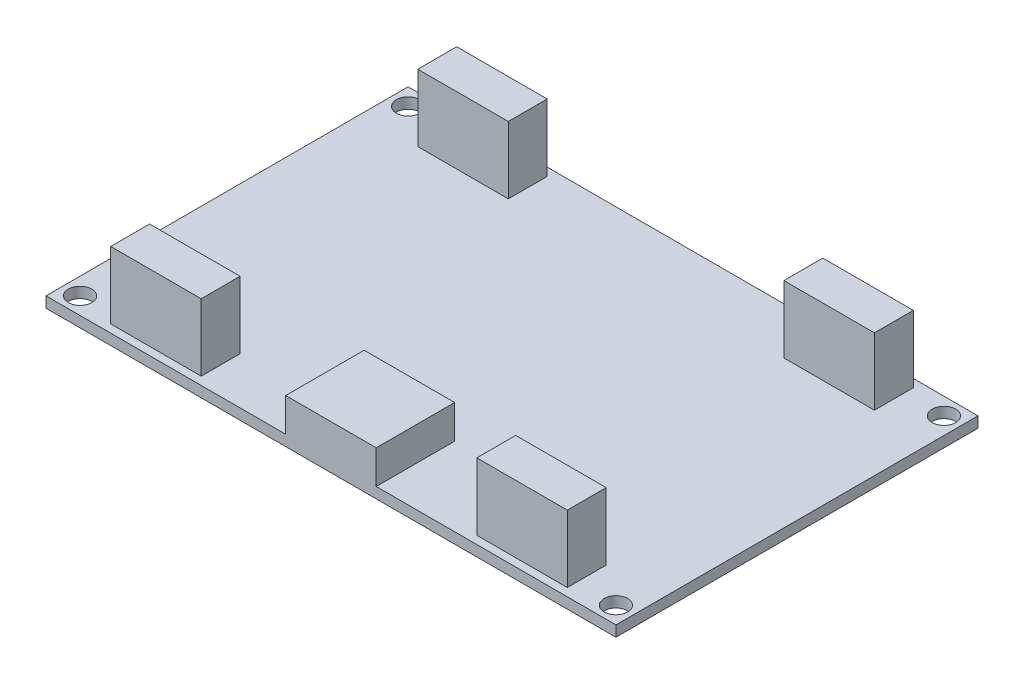
ISO-10303-21;
HEADER;
FILE_DESCRIPTION(('STEP AP214'),'2;1');
FILE_NAME('part.step','',(''),(''),'','','');
FILE_SCHEMA(('AUTOMOTIVE_DESIGN { 1 0 10303 214 1 1 1 1 }'));
ENDSEC;
DATA;
#1=APPLICATION_CONTEXT('core data for automotive mechanical design processes');
#2=APPLICATION_PROTOCOL_DEFINITION('international standard','automotive_design',2000,#1);
#3=PRODUCT_CONTEXT('',#1,'mechanical');
#4=PRODUCT('Part','Part','',(#3));
#5=PRODUCT_RELATED_PRODUCT_CATEGORY('part','',(#4));
#6=PRODUCT_DEFINITION_FORMATION('','',#4);
#7=PRODUCT_DEFINITION_CONTEXT('part definition',#1,'design');
#8=PRODUCT_DEFINITION('design','',#6,#7);
#9=PRODUCT_DEFINITION_SHAPE('','',#8);
#10=(LENGTH_UNIT() NAMED_UNIT(*) SI_UNIT(.MILLI.,.METRE.));
#11=(NAMED_UNIT(*) PLANE_ANGLE_UNIT() SI_UNIT($,.RADIAN.));
#12=(NAMED_UNIT(*) SI_UNIT($,.STERADIAN.) SOLID_ANGLE_UNIT());
#13=UNCERTAINTY_MEASURE_WITH_UNIT(LENGTH_MEASURE(1.E-05),#10,'distance_accuracy_value','');
#14=(GEOMETRIC_REPRESENTATION_CONTEXT(3) GLOBAL_UNCERTAINTY_ASSIGNED_CONTEXT((#13)) GLOBAL_UNIT_ASSIGNED_CONTEXT((#10,
#11,#12)) REPRESENTATION_CONTEXT('',''));
#15=CARTESIAN_POINT('',(0.,0.,0.));
#16=DIRECTION('',(0.,0.,1.));
#17=DIRECTION('',(1.,0.,0.));
#18=AXIS2_PLACEMENT_3D('',#15,#16,#17);
#19=CARTESIAN_POINT('',(0.,1.6,-54.));
#20=DIRECTION('',(0.,-1.,0.));
#21=DIRECTION('',(0.,0.,-1.));
#22=AXIS2_PLACEMENT_3D('',#19,#20,#21);
#23=PLANE('',#22);
#24=DIRECTION('',(0.,0.,-1.));
#25=VECTOR('',#24,1.);
#26=CARTESIAN_POINT('',(76.55,1.6,-7.));
#27=LINE('',#26,#25);
#28=CARTESIAN_POINT('',(76.55,1.6,-1.2));
#29=VERTEX_POINT('',#28);
#30=CARTESIAN_POINT('',(76.55,1.6,-7.));
#31=VERTEX_POINT('',#30);
#32=EDGE_CURVE('E382',#29,#31,#27,.T.);
#33=ORIENTED_EDGE('',*,*,#32,.F.);
#34=DIRECTION('',(1.,0.,0.));
#35=VECTOR('',#34,1.);
#36=CARTESIAN_POINT('',(63.05,1.6,-1.2));
#37=LINE('',#36,#35);
#38=CARTESIAN_POINT('',(63.05,1.6,-1.2));
#39=VERTEX_POINT('',#38);
#40=EDGE_CURVE('E384',#39,#29,#37,.T.);
#41=ORIENTED_EDGE('',*,*,#40,.F.);
#42=DIRECTION('',(0.,0.,1.));
#43=VECTOR('',#42,1.);
#44=CARTESIAN_POINT('',(63.05,1.6,-7.));
#45=LINE('',#44,#43);
#46=CARTESIAN_POINT('',(63.05,1.6,-7.));
#47=VERTEX_POINT('',#46);
#48=EDGE_CURVE('E387',#47,#39,#45,.T.);
#49=ORIENTED_EDGE('',*,*,#48,.F.);
#50=DIRECTION('',(-1.,0.,0.));
#51=VECTOR('',#50,1.);
#52=CARTESIAN_POINT('',(63.05,1.6,-7.));
#53=LINE('',#52,#51);
#54=EDGE_CURVE('E390',#31,#47,#53,.T.);
#55=ORIENTED_EDGE('',*,*,#54,.F.);
#56=EDGE_LOOP('',(#33,#41,#49,#55));
#57=FACE_BOUND('',#56,.T.);
#58=DIRECTION('',(0.,0.,-1.));
#59=VECTOR('',#58,1.);
#60=CARTESIAN_POINT('',(21.95,1.6,-7.));
#61=LINE('',#60,#59);
#62=CARTESIAN_POINT('',(21.95,1.6,-1.2));
#63=VERTEX_POINT('',#62);
#64=CARTESIAN_POINT('',(21.95,1.6,-7.));
#65=VERTEX_POINT('',#64);
#66=EDGE_CURVE('E347',#63,#65,#61,.T.);
#67=ORIENTED_EDGE('',*,*,#66,.F.);
#68=DIRECTION('',(1.,0.,0.));
#69=VECTOR('',#68,1.);
#70=CARTESIAN_POINT('',(8.45000000000001,1.6,-1.2));
#71=LINE('',#70,#69);
#72=CARTESIAN_POINT('',(8.45000000000001,1.6,-1.2));
#73=VERTEX_POINT('',#72);
#74=EDGE_CURVE('E349',#73,#63,#71,.T.);
#75=ORIENTED_EDGE('',*,*,#74,.F.);
#76=DIRECTION('',(0.,0.,1.));
#77=VECTOR('',#76,1.);
#78=CARTESIAN_POINT('',(8.45000000000001,1.6,-7.));
#79=LINE('',#78,#77);
#80=CARTESIAN_POINT('',(8.45000000000001,1.6,-7.));
#81=VERTEX_POINT('',#80);
#82=EDGE_CURVE('E352',#81,#73,#79,.T.);
#83=ORIENTED_EDGE('',*,*,#82,.F.);
#84=DIRECTION('',(-1.,0.,0.));
#85=VECTOR('',#84,1.);
#86=CARTESIAN_POINT('',(8.45000000000001,1.6,-7.));
#87=LINE('',#86,#85);
#88=EDGE_CURVE('E355',#65,#81,#87,.T.);
#89=ORIENTED_EDGE('',*,*,#88,.F.);
#90=EDGE_LOOP('',(#67,#75,#83,#89));
#91=FACE_BOUND('',#90,.T.);
#92=DIRECTION('',(0.,0.,-1.));
#93=VECTOR('',#92,1.);
#94=CARTESIAN_POINT('',(76.55,1.6,-52.8));
#95=LINE('',#94,#93);
#96=CARTESIAN_POINT('',(76.55,1.6,-47.));
#97=VERTEX_POINT('',#96);
#98=CARTESIAN_POINT('',(76.55,1.6,-52.8));
#99=VERTEX_POINT('',#98);
#100=EDGE_CURVE('E256',#97,#99,#95,.T.);
#101=ORIENTED_EDGE('',*,*,#100,.F.);
#102=DIRECTION('',(1.,0.,0.));
#103=VECTOR('',#102,1.);
#104=CARTESIAN_POINT('',(63.05,1.6,-47.));
#105=LINE('',#104,#103);
#106=CARTESIAN_POINT('',(63.05,1.6,-47.));
#107=VERTEX_POINT('',#106);
#108=EDGE_CURVE('E221',#107,#97,#105,.T.);
#109=ORIENTED_EDGE('',*,*,#108,.F.);
#110=DIRECTION('',(0.,0.,1.));
#111=VECTOR('',#110,1.);
#112=CARTESIAN_POINT('',(63.05,1.6,-52.8));
#113=LINE('',#112,#111);
#114=CARTESIAN_POINT('',(63.05,1.6,-52.8));
#115=VERTEX_POINT('',#114);
#116=EDGE_CURVE('E244',#115,#107,#113,.T.);
#117=ORIENTED_EDGE('',*,*,#116,.F.);
#118=DIRECTION('',(-1.,0.,0.));
#119=VECTOR('',#118,1.);
#120=CARTESIAN_POINT('',(63.05,1.6,-52.8));
#121=LINE('',#120,#119);
#122=EDGE_CURVE('E250',#99,#115,#121,.T.);
#123=ORIENTED_EDGE('',*,*,#122,.F.);
#124=EDGE_LOOP('',(#101,#109,#117,#123));
#125=FACE_BOUND('',#124,.T.);
#126=CARTESIAN_POINT('',(82.46,1.6,-2.54));
#127=DIRECTION('',(0.,1.,0.));
#128=DIRECTION('',(0.,0.,1.));
#129=AXIS2_PLACEMENT_3D('',#126,#127,#128);
#130=CIRCLE('',#129,1.75);
#131=CARTESIAN_POINT('',(82.46,1.6,-0.789999999999999));
#132=VERTEX_POINT('',#131);
#133=EDGE_CURVE('E310',#132,#132,#130,.T.);
#134=ORIENTED_EDGE('',*,*,#133,.F.);
#135=EDGE_LOOP('',(#134));
#136=FACE_BOUND('',#135,.T.);
#137=CARTESIAN_POINT('',(82.46,1.6,-51.46));
#138=DIRECTION('',(0.,1.,0.));
#139=DIRECTION('',(0.,0.,1.));
#140=AXIS2_PLACEMENT_3D('',#137,#138,#139);
#141=CIRCLE('',#140,1.75);
#142=CARTESIAN_POINT('',(82.46,1.6,-49.71));
#143=VERTEX_POINT('',#142);
#144=EDGE_CURVE('E304',#143,#143,#141,.T.);
#145=ORIENTED_EDGE('',*,*,#144,.F.);
#146=EDGE_LOOP('',(#145));
#147=FACE_BOUND('',#146,.T.);
#148=CARTESIAN_POINT('',(2.54,1.6,-51.46));
#149=DIRECTION('',(0.,1.,0.));
#150=DIRECTION('',(0.,0.,1.));
#151=AXIS2_PLACEMENT_3D('',#148,#149,#150);
#152=CIRCLE('',#151,1.75);
#153=CARTESIAN_POINT('',(2.54,1.6,-49.71));
#154=VERTEX_POINT('',#153);
#155=EDGE_CURVE('E298',#154,#154,#152,.T.);
#156=ORIENTED_EDGE('',*,*,#155,.F.);
#157=EDGE_LOOP('',(#156));
#158=FACE_BOUND('',#157,.T.);
#159=CARTESIAN_POINT('',(2.54,1.6,-2.54));
#160=DIRECTION('',(0.,1.,0.));
#161=DIRECTION('',(0.,0.,1.));
#162=AXIS2_PLACEMENT_3D('',#159,#160,#161);
#163=CIRCLE('',#162,1.75);
#164=CARTESIAN_POINT('',(2.54,1.6,-0.79));
#165=VERTEX_POINT('',#164);
#166=EDGE_CURVE('E292',#165,#165,#163,.T.);
#167=ORIENTED_EDGE('',*,*,#166,.F.);
#168=EDGE_LOOP('',(#167));
#169=FACE_BOUND('',#168,.T.);
#170=DIRECTION('',(0.,0.,-1.));
#171=VECTOR('',#170,1.);
#172=CARTESIAN_POINT('',(21.95,1.6,-52.8));
#173=LINE('',#172,#171);
#174=CARTESIAN_POINT('',(21.95,1.6,-47.));
#175=VERTEX_POINT('',#174);
#176=CARTESIAN_POINT('',(21.95,1.6,-52.8));
#177=VERTEX_POINT('',#176);
#178=EDGE_CURVE('E259',#175,#177,#173,.T.);
#179=ORIENTED_EDGE('',*,*,#178,.F.);
#180=DIRECTION('',(1.,0.,0.));
#181=VECTOR('',#180,1.);
#182=CARTESIAN_POINT('',(8.45000000000001,1.6,-47.));
#183=LINE('',#182,#181);
#184=CARTESIAN_POINT('',(8.45000000000001,1.6,-47.));
#185=VERTEX_POINT('',#184);
#186=EDGE_CURVE('E264',#185,#175,#183,.T.);
#187=ORIENTED_EDGE('',*,*,#186,.F.);
#188=DIRECTION('',(0.,0.,1.));
#189=VECTOR('',#188,1.);
#190=CARTESIAN_POINT('',(8.45000000000001,1.6,-52.8));
#191=LINE('',#190,#189);
#192=CARTESIAN_POINT('',(8.45000000000001,1.6,-52.8));
#193=VERTEX_POINT('',#192);
#194=EDGE_CURVE('E276',#193,#185,#191,.T.);
#195=ORIENTED_EDGE('',*,*,#194,.F.);
#196=DIRECTION('',(-1.,0.,0.));
#197=VECTOR('',#196,1.);
#198=CARTESIAN_POINT('',(8.45000000000001,1.6,-52.8));
#199=LINE('',#198,#197);
#200=EDGE_CURVE('E273',#177,#193,#199,.T.);
#201=ORIENTED_EDGE('',*,*,#200,.F.);
#202=EDGE_LOOP('',(#179,#187,#195,#201));
#203=FACE_BOUND('',#202,.T.);
#204=DIRECTION('',(0.,0.,-1.));
#205=VECTOR('',#204,1.);
#206=CARTESIAN_POINT('',(49.25,1.6,-11.7));
#207=LINE('',#206,#205);
#208=CARTESIAN_POINT('',(49.25,1.6,0.));
#209=VERTEX_POINT('',#208);
#210=CARTESIAN_POINT('',(49.25,1.6,-11.7));
#211=VERTEX_POINT('',#210);
#212=EDGE_CURVE('E220',#209,#211,#207,.T.);
#213=ORIENTED_EDGE('',*,*,#212,.F.);
#214=DIRECTION('',(1.,0.,0.));
#215=VECTOR('',#214,1.);
#216=CARTESIAN_POINT('',(0.,1.6,0.));
#217=LINE('',#216,#215);
#218=CARTESIAN_POINT('',(85.,1.6,0.));
#219=VERTEX_POINT('',#218);
#220=EDGE_CURVE('E320',#209,#219,#217,.T.);
#221=ORIENTED_EDGE('',*,*,#220,.T.);
#222=DIRECTION('',(0.,0.,-1.));
#223=VECTOR('',#222,1.);
#224=CARTESIAN_POINT('',(85.,1.6,0.));
#225=LINE('',#224,#223);
#226=CARTESIAN_POINT('',(85.,1.6,-54.));
#227=VERTEX_POINT('',#226);
#228=EDGE_CURVE('E324',#219,#227,#225,.T.);
#229=ORIENTED_EDGE('',*,*,#228,.T.);
#230=DIRECTION('',(-1.,0.,0.));
#231=VECTOR('',#230,1.);
#232=CARTESIAN_POINT('',(0.,1.6,-54.));
#233=LINE('',#232,#231);
#234=CARTESIAN_POINT('',(0.,1.6,-54.));
#235=VERTEX_POINT('',#234);
#236=EDGE_CURVE('E326',#227,#235,#233,.T.);
#237=ORIENTED_EDGE('',*,*,#236,.T.);
#238=DIRECTION('',(0.,0.,1.));
#239=VECTOR('',#238,1.);
#240=CARTESIAN_POINT('',(0.,1.6,0.));
#241=LINE('',#240,#239);
#242=CARTESIAN_POINT('',(0.,1.6,0.));
#243=VERTEX_POINT('',#242);
#244=EDGE_CURVE('E317',#235,#243,#241,.T.);
#245=ORIENTED_EDGE('',*,*,#244,.T.);
#246=CARTESIAN_POINT('',(35.75,1.6,0.));
#247=VERTEX_POINT('',#246);
#248=EDGE_CURVE('E322',#243,#247,#217,.T.);
#249=ORIENTED_EDGE('',*,*,#248,.T.);
#250=DIRECTION('',(0.,0.,1.));
#251=VECTOR('',#250,1.);
#252=CARTESIAN_POINT('',(35.75,1.6,-11.7));
#253=LINE('',#252,#251);
#254=CARTESIAN_POINT('',(35.75,1.6,-11.7));
#255=VERTEX_POINT('',#254);
#256=EDGE_CURVE('E59',#255,#247,#253,.T.);
#257=ORIENTED_EDGE('',*,*,#256,.F.);
#258=DIRECTION('',(-1.,0.,0.));
#259=VECTOR('',#258,1.);
#260=CARTESIAN_POINT('',(35.75,1.6,-11.7));
#261=LINE('',#260,#259);
#262=EDGE_CURVE('E54',#211,#255,#261,.T.);
#263=ORIENTED_EDGE('',*,*,#262,.F.);
#264=EDGE_LOOP('',(#213,#221,#229,#237,#245,#249,#257,#263));
#265=FACE_BOUND('',#264,.T.);
#266=ADVANCED_FACE('F39',(#57,#91,#125,#136,#147,#158,#169,#203,#265),#23,.F.);
#267=CARTESIAN_POINT('',(0.,0.,-54.));
#268=DIRECTION('',(0.,-1.,0.));
#269=DIRECTION('',(0.,0.,-1.));
#270=AXIS2_PLACEMENT_3D('',#267,#268,#269);
#271=PLANE('',#270);
#272=CARTESIAN_POINT('',(2.54,0.,-51.46));
#273=DIRECTION('',(0.,1.,0.));
#274=DIRECTION('',(0.,0.,1.));
#275=AXIS2_PLACEMENT_3D('',#272,#273,#274);
#276=CIRCLE('',#275,1.75);
#277=CARTESIAN_POINT('',(2.54,0.,-49.71));
#278=VERTEX_POINT('',#277);
#279=EDGE_CURVE('E301',#278,#278,#276,.T.);
#280=ORIENTED_EDGE('',*,*,#279,.T.);
#281=EDGE_LOOP('',(#280));
#282=FACE_BOUND('',#281,.T.);
#283=CARTESIAN_POINT('',(82.46,0.,-2.54));
#284=DIRECTION('',(0.,1.,0.));
#285=DIRECTION('',(0.,0.,1.));
#286=AXIS2_PLACEMENT_3D('',#283,#284,#285);
#287=CIRCLE('',#286,1.75);
#288=CARTESIAN_POINT('',(82.46,0.,-0.789999999999999));
#289=VERTEX_POINT('',#288);
#290=EDGE_CURVE('E313',#289,#289,#287,.T.);
#291=ORIENTED_EDGE('',*,*,#290,.T.);
#292=EDGE_LOOP('',(#291));
#293=FACE_BOUND('',#292,.T.);
#294=DIRECTION('',(0.,0.,1.));
#295=VECTOR('',#294,1.);
#296=CARTESIAN_POINT('',(0.,0.,0.));
#297=LINE('',#296,#295);
#298=CARTESIAN_POINT('',(0.,0.,-54.));
#299=VERTEX_POINT('',#298);
#300=CARTESIAN_POINT('',(0.,0.,0.));
#301=VERTEX_POINT('',#300);
#302=EDGE_CURVE('E316',#299,#301,#297,.T.);
#303=ORIENTED_EDGE('',*,*,#302,.F.);
#304=DIRECTION('',(-1.,0.,0.));
#305=VECTOR('',#304,1.);
#306=CARTESIAN_POINT('',(0.,0.,-54.));
#307=LINE('',#306,#305);
#308=CARTESIAN_POINT('',(85.,0.,-54.));
#309=VERTEX_POINT('',#308);
#310=EDGE_CURVE('E321',#309,#299,#307,.T.);
#311=ORIENTED_EDGE('',*,*,#310,.F.);
#312=DIRECTION('',(0.,0.,-1.));
#313=VECTOR('',#312,1.);
#314=CARTESIAN_POINT('',(85.,0.,0.));
#315=LINE('',#314,#313);
#316=CARTESIAN_POINT('',(85.,0.,0.));
#317=VERTEX_POINT('',#316);
#318=EDGE_CURVE('E333',#317,#309,#315,.T.);
#319=ORIENTED_EDGE('',*,*,#318,.F.);
#320=DIRECTION('',(1.,0.,0.));
#321=VECTOR('',#320,1.);
#322=CARTESIAN_POINT('',(0.,0.,0.));
#323=LINE('',#322,#321);
#324=EDGE_CURVE('E331',#301,#317,#323,.T.);
#325=ORIENTED_EDGE('',*,*,#324,.F.);
#326=EDGE_LOOP('',(#303,#311,#319,#325));
#327=FACE_BOUND('',#326,.T.);
#328=CARTESIAN_POINT('',(82.46,0.,-51.46));
#329=DIRECTION('',(0.,1.,0.));
#330=DIRECTION('',(0.,0.,1.));
#331=AXIS2_PLACEMENT_3D('',#328,#329,#330);
#332=CIRCLE('',#331,1.75);
#333=CARTESIAN_POINT('',(82.46,0.,-49.71));
#334=VERTEX_POINT('',#333);
#335=EDGE_CURVE('E307',#334,#334,#332,.T.);
#336=ORIENTED_EDGE('',*,*,#335,.T.);
#337=EDGE_LOOP('',(#336));
#338=FACE_BOUND('',#337,.T.);
#339=CARTESIAN_POINT('',(2.54,0.,-2.54));
#340=DIRECTION('',(0.,1.,0.));
#341=DIRECTION('',(0.,0.,1.));
#342=AXIS2_PLACEMENT_3D('',#339,#340,#341);
#343=CIRCLE('',#342,1.75);
#344=CARTESIAN_POINT('',(2.54,0.,-0.790000000000001));
#345=VERTEX_POINT('',#344);
#346=EDGE_CURVE('E295',#345,#345,#343,.T.);
#347=ORIENTED_EDGE('',*,*,#346,.T.);
#348=EDGE_LOOP('',(#347));
#349=FACE_BOUND('',#348,.T.);
#350=ADVANCED_FACE('F428',(#282,#293,#327,#338,#349),#271,.T.);
#351=CARTESIAN_POINT('',(0.,1.6,0.));
#352=DIRECTION('',(1.,0.,0.));
#353=DIRECTION('',(0.,0.,-1.));
#354=AXIS2_PLACEMENT_3D('',#351,#352,#353);
#355=PLANE('',#354);
#356=ORIENTED_EDGE('',*,*,#302,.T.);
#357=DIRECTION('',(0.,-1.,0.));
#358=VECTOR('',#357,1.);
#359=CARTESIAN_POINT('',(0.,1.6,0.));
#360=LINE('',#359,#358);
#361=EDGE_CURVE('E344',#243,#301,#360,.T.);
#362=ORIENTED_EDGE('',*,*,#361,.F.);
#363=ORIENTED_EDGE('',*,*,#244,.F.);
#364=DIRECTION('',(0.,-1.,0.));
#365=VECTOR('',#364,1.);
#366=CARTESIAN_POINT('',(0.,1.6,-54.));
#367=LINE('',#366,#365);
#368=EDGE_CURVE('E328',#235,#299,#367,.T.);
#369=ORIENTED_EDGE('',*,*,#368,.T.);
#370=EDGE_LOOP('',(#356,#362,#363,#369));
#371=FACE_BOUND('',#370,.T.);
#372=ADVANCED_FACE('F457',(#371),#355,.F.);
#373=CARTESIAN_POINT('',(0.,1.6,0.));
#374=DIRECTION('',(0.,0.,-1.));
#375=DIRECTION('',(-1.,0.,0.));
#376=AXIS2_PLACEMENT_3D('',#373,#374,#375);
#377=PLANE('',#376);
#378=ORIENTED_EDGE('',*,*,#324,.T.);
#379=DIRECTION('',(0.,-1.,0.));
#380=VECTOR('',#379,1.);
#381=CARTESIAN_POINT('',(85.,1.6,0.));
#382=LINE('',#381,#380);
#383=EDGE_CURVE('E341',#219,#317,#382,.T.);
#384=ORIENTED_EDGE('',*,*,#383,.F.);
#385=ORIENTED_EDGE('',*,*,#220,.F.);
#386=DIRECTION('',(0.,-1.,0.));
#387=VECTOR('',#386,1.);
#388=CARTESIAN_POINT('',(49.25,6.6,0.));
#389=LINE('',#388,#387);
#390=CARTESIAN_POINT('',(49.25,6.6,0.));
#391=VERTEX_POINT('',#390);
#392=EDGE_CURVE('E443',#391,#209,#389,.T.);
#393=ORIENTED_EDGE('',*,*,#392,.F.);
#394=DIRECTION('',(1.,0.,0.));
#395=VECTOR('',#394,1.);
#396=CARTESIAN_POINT('',(35.75,6.6,0.));
#397=LINE('',#396,#395);
#398=CARTESIAN_POINT('',(35.75,6.6,0.));
#399=VERTEX_POINT('',#398);
#400=EDGE_CURVE('E214',#399,#391,#397,.T.);
#401=ORIENTED_EDGE('',*,*,#400,.F.);
#402=DIRECTION('',(0.,-1.,0.));
#403=VECTOR('',#402,1.);
#404=CARTESIAN_POINT('',(35.75,6.6,0.));
#405=LINE('',#404,#403);
#406=EDGE_CURVE('E226',#399,#247,#405,.T.);
#407=ORIENTED_EDGE('',*,*,#406,.T.);
#408=ORIENTED_EDGE('',*,*,#248,.F.);
#409=ORIENTED_EDGE('',*,*,#361,.T.);
#410=EDGE_LOOP('',(#378,#384,#385,#393,#401,#407,#408,#409));
#411=FACE_BOUND('',#410,.T.);
#412=ADVANCED_FACE('F454',(#411),#377,.F.);
#413=CARTESIAN_POINT('',(85.,1.6,0.));
#414=DIRECTION('',(-1.,0.,0.));
#415=DIRECTION('',(0.,0.,1.));
#416=AXIS2_PLACEMENT_3D('',#413,#414,#415);
#417=PLANE('',#416);
#418=ORIENTED_EDGE('',*,*,#318,.T.);
#419=DIRECTION('',(0.,-1.,0.));
#420=VECTOR('',#419,1.);
#421=CARTESIAN_POINT('',(85.,1.6,-54.));
#422=LINE('',#421,#420);
#423=EDGE_CURVE('E338',#227,#309,#422,.T.);
#424=ORIENTED_EDGE('',*,*,#423,.F.);
#425=ORIENTED_EDGE('',*,*,#228,.F.);
#426=ORIENTED_EDGE('',*,*,#383,.T.);
#427=EDGE_LOOP('',(#418,#424,#425,#426));
#428=FACE_BOUND('',#427,.T.);
#429=ADVANCED_FACE('F456',(#428),#417,.F.);
#430=CARTESIAN_POINT('',(0.,1.6,-54.));
#431=DIRECTION('',(0.,0.,1.));
#432=DIRECTION('',(1.,0.,0.));
#433=AXIS2_PLACEMENT_3D('',#430,#431,#432);
#434=PLANE('',#433);
#435=ORIENTED_EDGE('',*,*,#310,.T.);
#436=ORIENTED_EDGE('',*,*,#368,.F.);
#437=ORIENTED_EDGE('',*,*,#236,.F.);
#438=ORIENTED_EDGE('',*,*,#423,.T.);
#439=EDGE_LOOP('',(#435,#436,#437,#438));
#440=FACE_BOUND('',#439,.T.);
#441=ADVANCED_FACE('F463',(#440),#434,.F.);
#442=CARTESIAN_POINT('',(82.46,1.6,-2.54));
#443=DIRECTION('',(0.,1.,0.));
#444=DIRECTION('',(0.,0.,1.));
#445=AXIS2_PLACEMENT_3D('',#442,#443,#444);
#446=CYLINDRICAL_SURFACE('',#445,1.75);
#447=ORIENTED_EDGE('',*,*,#290,.F.);
#448=EDGE_LOOP('',(#447));
#449=FACE_BOUND('',#448,.T.);
#450=ORIENTED_EDGE('',*,*,#133,.T.);
#451=EDGE_LOOP('',(#450));
#452=FACE_BOUND('',#451,.T.);
#453=ADVANCED_FACE('F627',(#449,#452),#446,.F.);
#454=CARTESIAN_POINT('',(82.46,1.6,-51.46));
#455=DIRECTION('',(0.,1.,0.));
#456=DIRECTION('',(0.,0.,1.));
#457=AXIS2_PLACEMENT_3D('',#454,#455,#456);
#458=CYLINDRICAL_SURFACE('',#457,1.75);
#459=ORIENTED_EDGE('',*,*,#335,.F.);
#460=EDGE_LOOP('',(#459));
#461=FACE_BOUND('',#460,.T.);
#462=ORIENTED_EDGE('',*,*,#144,.T.);
#463=EDGE_LOOP('',(#462));
#464=FACE_BOUND('',#463,.T.);
#465=ADVANCED_FACE('F619',(#461,#464),#458,.F.);
#466=CARTESIAN_POINT('',(2.54,1.6,-51.46));
#467=DIRECTION('',(0.,1.,0.));
#468=DIRECTION('',(0.,0.,1.));
#469=AXIS2_PLACEMENT_3D('',#466,#467,#468);
#470=CYLINDRICAL_SURFACE('',#469,1.75);
#471=ORIENTED_EDGE('',*,*,#279,.F.);
#472=EDGE_LOOP('',(#471));
#473=FACE_BOUND('',#472,.T.);
#474=ORIENTED_EDGE('',*,*,#155,.T.);
#475=EDGE_LOOP('',(#474));
#476=FACE_BOUND('',#475,.T.);
#477=ADVANCED_FACE('F611',(#473,#476),#470,.F.);
#478=CARTESIAN_POINT('',(2.54,1.6,-2.54));
#479=DIRECTION('',(0.,1.,0.));
#480=DIRECTION('',(0.,0.,1.));
#481=AXIS2_PLACEMENT_3D('',#478,#479,#480);
#482=CYLINDRICAL_SURFACE('',#481,1.75);
#483=ORIENTED_EDGE('',*,*,#346,.F.);
#484=EDGE_LOOP('',(#483));
#485=FACE_BOUND('',#484,.T.);
#486=ORIENTED_EDGE('',*,*,#166,.T.);
#487=EDGE_LOOP('',(#486));
#488=FACE_BOUND('',#487,.T.);
#489=ADVANCED_FACE('F603',(#485,#488),#482,.F.);
#490=CARTESIAN_POINT('',(21.95,11.6,-52.8));
#491=DIRECTION('',(-1.,0.,0.));
#492=DIRECTION('',(0.,0.,1.));
#493=AXIS2_PLACEMENT_3D('',#490,#491,#492);
#494=PLANE('',#493);
#495=ORIENTED_EDGE('',*,*,#178,.T.);
#496=DIRECTION('',(0.,-1.,0.));
#497=VECTOR('',#496,1.);
#498=CARTESIAN_POINT('',(21.95,11.6,-52.8));
#499=LINE('',#498,#497);
#500=CARTESIAN_POINT('',(21.95,11.6,-52.8));
#501=VERTEX_POINT('',#500);
#502=EDGE_CURVE('E289',#501,#177,#499,.T.);
#503=ORIENTED_EDGE('',*,*,#502,.F.);
#504=DIRECTION('',(0.,0.,-1.));
#505=VECTOR('',#504,1.);
#506=CARTESIAN_POINT('',(21.95,11.6,-52.8));
#507=LINE('',#506,#505);
#508=CARTESIAN_POINT('',(21.95,11.6,-47.));
#509=VERTEX_POINT('',#508);
#510=EDGE_CURVE('E260',#509,#501,#507,.T.);
#511=ORIENTED_EDGE('',*,*,#510,.F.);
#512=DIRECTION('',(0.,-1.,0.));
#513=VECTOR('',#512,1.);
#514=CARTESIAN_POINT('',(21.95,11.6,-47.));
#515=LINE('',#514,#513);
#516=EDGE_CURVE('E270',#509,#175,#515,.T.);
#517=ORIENTED_EDGE('',*,*,#516,.T.);
#518=EDGE_LOOP('',(#495,#503,#511,#517));
#519=FACE_BOUND('',#518,.T.);
#520=ADVANCED_FACE('F595',(#519),#494,.F.);
#521=CARTESIAN_POINT('',(8.45000000000001,11.6,-52.8));
#522=DIRECTION('',(0.,0.,1.));
#523=DIRECTION('',(1.,0.,0.));
#524=AXIS2_PLACEMENT_3D('',#521,#522,#523);
#525=PLANE('',#524);
#526=ORIENTED_EDGE('',*,*,#200,.T.);
#527=DIRECTION('',(0.,-1.,0.));
#528=VECTOR('',#527,1.);
#529=CARTESIAN_POINT('',(8.45000000000001,11.6,-52.8));
#530=LINE('',#529,#528);
#531=CARTESIAN_POINT('',(8.45000000000001,11.6,-52.8));
#532=VERTEX_POINT('',#531);
#533=EDGE_CURVE('E286',#532,#193,#530,.T.);
#534=ORIENTED_EDGE('',*,*,#533,.F.);
#535=DIRECTION('',(-1.,0.,0.));
#536=VECTOR('',#535,1.);
#537=CARTESIAN_POINT('',(8.45000000000001,11.6,-52.8));
#538=LINE('',#537,#536);
#539=EDGE_CURVE('E263',#501,#532,#538,.T.);
#540=ORIENTED_EDGE('',*,*,#539,.F.);
#541=ORIENTED_EDGE('',*,*,#502,.T.);
#542=EDGE_LOOP('',(#526,#534,#540,#541));
#543=FACE_BOUND('',#542,.T.);
#544=ADVANCED_FACE('F587',(#543),#525,.F.);
#545=CARTESIAN_POINT('',(8.45000000000001,11.6,-52.8));
#546=DIRECTION('',(1.,0.,0.));
#547=DIRECTION('',(0.,0.,-1.));
#548=AXIS2_PLACEMENT_3D('',#545,#546,#547);
#549=PLANE('',#548);
#550=ORIENTED_EDGE('',*,*,#194,.T.);
#551=DIRECTION('',(0.,-1.,0.));
#552=VECTOR('',#551,1.);
#553=CARTESIAN_POINT('',(8.45000000000001,11.6,-47.));
#554=LINE('',#553,#552);
#555=CARTESIAN_POINT('',(8.45000000000001,11.6,-47.));
#556=VERTEX_POINT('',#555);
#557=EDGE_CURVE('E283',#556,#185,#554,.T.);
#558=ORIENTED_EDGE('',*,*,#557,.F.);
#559=DIRECTION('',(0.,0.,1.));
#560=VECTOR('',#559,1.);
#561=CARTESIAN_POINT('',(8.45000000000001,11.6,-52.8));
#562=LINE('',#561,#560);
#563=EDGE_CURVE('E266',#532,#556,#562,.T.);
#564=ORIENTED_EDGE('',*,*,#563,.F.);
#565=ORIENTED_EDGE('',*,*,#533,.T.);
#566=EDGE_LOOP('',(#550,#558,#564,#565));
#567=FACE_BOUND('',#566,.T.);
#568=ADVANCED_FACE('F579',(#567),#549,.F.);
#569=CARTESIAN_POINT('',(8.45000000000001,11.6,-47.));
#570=DIRECTION('',(0.,0.,-1.));
#571=DIRECTION('',(-1.,0.,0.));
#572=AXIS2_PLACEMENT_3D('',#569,#570,#571);
#573=PLANE('',#572);
#574=ORIENTED_EDGE('',*,*,#186,.T.);
#575=ORIENTED_EDGE('',*,*,#516,.F.);
#576=DIRECTION('',(1.,0.,0.));
#577=VECTOR('',#576,1.);
#578=CARTESIAN_POINT('',(8.45000000000001,11.6,-47.));
#579=LINE('',#578,#577);
#580=EDGE_CURVE('E268',#556,#509,#579,.T.);
#581=ORIENTED_EDGE('',*,*,#580,.F.);
#582=ORIENTED_EDGE('',*,*,#557,.T.);
#583=EDGE_LOOP('',(#574,#575,#581,#582));
#584=FACE_BOUND('',#583,.T.);
#585=ADVANCED_FACE('F571',(#584),#573,.F.);
#586=CARTESIAN_POINT('',(21.95,11.6,-47.));
#587=DIRECTION('',(0.,1.,0.));
#588=DIRECTION('',(0.,0.,1.));
#589=AXIS2_PLACEMENT_3D('',#586,#587,#588);
#590=PLANE('',#589);
#591=ORIENTED_EDGE('',*,*,#510,.T.);
#592=ORIENTED_EDGE('',*,*,#539,.T.);
#593=ORIENTED_EDGE('',*,*,#563,.T.);
#594=ORIENTED_EDGE('',*,*,#580,.T.);
#595=EDGE_LOOP('',(#591,#592,#593,#594));
#596=FACE_BOUND('',#595,.T.);
#597=ADVANCED_FACE('F539',(#596),#590,.T.);
#598=CARTESIAN_POINT('',(76.55,11.6,-52.8));
#599=DIRECTION('',(-1.,0.,0.));
#600=DIRECTION('',(0.,0.,1.));
#601=AXIS2_PLACEMENT_3D('',#598,#599,#600);
#602=PLANE('',#601);
#603=ORIENTED_EDGE('',*,*,#100,.T.);
#604=DIRECTION('',(0.,-1.,0.));
#605=VECTOR('',#604,1.);
#606=CARTESIAN_POINT('',(76.55,11.6,-52.8));
#607=LINE('',#606,#605);
#608=CARTESIAN_POINT('',(76.55,11.6,-52.8));
#609=VERTEX_POINT('',#608);
#610=EDGE_CURVE('E253',#609,#99,#607,.T.);
#611=ORIENTED_EDGE('',*,*,#610,.F.);
#612=DIRECTION('',(0.,0.,-1.));
#613=VECTOR('',#612,1.);
#614=CARTESIAN_POINT('',(76.55,11.6,-52.8));
#615=LINE('',#614,#613);
#616=CARTESIAN_POINT('',(76.55,11.6,-47.));
#617=VERTEX_POINT('',#616);
#618=EDGE_CURVE('E224',#617,#609,#615,.T.);
#619=ORIENTED_EDGE('',*,*,#618,.F.);
#620=DIRECTION('',(0.,-1.,0.));
#621=VECTOR('',#620,1.);
#622=CARTESIAN_POINT('',(76.55,11.6,-47.));
#623=LINE('',#622,#621);
#624=EDGE_CURVE('E238',#617,#97,#623,.T.);
#625=ORIENTED_EDGE('',*,*,#624,.T.);
#626=EDGE_LOOP('',(#603,#611,#619,#625));
#627=FACE_BOUND('',#626,.T.);
#628=ADVANCED_FACE('F491',(#627),#602,.F.);
#629=CARTESIAN_POINT('',(63.05,11.6,-52.8));
#630=DIRECTION('',(0.,0.,1.));
#631=DIRECTION('',(1.,0.,0.));
#632=AXIS2_PLACEMENT_3D('',#629,#630,#631);
#633=PLANE('',#632);
#634=ORIENTED_EDGE('',*,*,#122,.T.);
#635=DIRECTION('',(0.,-1.,0.));
#636=VECTOR('',#635,1.);
#637=CARTESIAN_POINT('',(63.05,11.6,-52.8));
#638=LINE('',#637,#636);
#639=CARTESIAN_POINT('',(63.05,11.6,-52.8));
#640=VERTEX_POINT('',#639);
#641=EDGE_CURVE('E247',#640,#115,#638,.T.);
#642=ORIENTED_EDGE('',*,*,#641,.F.);
#643=DIRECTION('',(-1.,0.,0.));
#644=VECTOR('',#643,1.);
#645=CARTESIAN_POINT('',(63.05,11.6,-52.8));
#646=LINE('',#645,#644);
#647=EDGE_CURVE('E231',#609,#640,#646,.T.);
#648=ORIENTED_EDGE('',*,*,#647,.F.);
#649=ORIENTED_EDGE('',*,*,#610,.T.);
#650=EDGE_LOOP('',(#634,#642,#648,#649));
#651=FACE_BOUND('',#650,.T.);
#652=ADVANCED_FACE('F551',(#651),#633,.F.);
#653=CARTESIAN_POINT('',(63.05,11.6,-52.8));
#654=DIRECTION('',(1.,0.,0.));
#655=DIRECTION('',(0.,0.,-1.));
#656=AXIS2_PLACEMENT_3D('',#653,#654,#655);
#657=PLANE('',#656);
#658=ORIENTED_EDGE('',*,*,#116,.T.);
#659=DIRECTION('',(0.,-1.,0.));
#660=VECTOR('',#659,1.);
#661=CARTESIAN_POINT('',(63.05,11.6,-47.));
#662=LINE('',#661,#660);
#663=CARTESIAN_POINT('',(63.05,11.6,-47.));
#664=VERTEX_POINT('',#663);
#665=EDGE_CURVE('E241',#664,#107,#662,.T.);
#666=ORIENTED_EDGE('',*,*,#665,.F.);
#667=DIRECTION('',(0.,0.,1.));
#668=VECTOR('',#667,1.);
#669=CARTESIAN_POINT('',(63.05,11.6,-52.8));
#670=LINE('',#669,#668);
#671=EDGE_CURVE('E233',#640,#664,#670,.T.);
#672=ORIENTED_EDGE('',*,*,#671,.F.);
#673=ORIENTED_EDGE('',*,*,#641,.T.);
#674=EDGE_LOOP('',(#658,#666,#672,#673));
#675=FACE_BOUND('',#674,.T.);
#676=ADVANCED_FACE('F544',(#675),#657,.F.);
#677=CARTESIAN_POINT('',(63.05,11.6,-47.));
#678=DIRECTION('',(0.,0.,-1.));
#679=DIRECTION('',(-1.,0.,0.));
#680=AXIS2_PLACEMENT_3D('',#677,#678,#679);
#681=PLANE('',#680);
#682=ORIENTED_EDGE('',*,*,#108,.T.);
#683=ORIENTED_EDGE('',*,*,#624,.F.);
#684=DIRECTION('',(1.,0.,0.));
#685=VECTOR('',#684,1.);
#686=CARTESIAN_POINT('',(63.05,11.6,-47.));
#687=LINE('',#686,#685);
#688=EDGE_CURVE('E235',#664,#617,#687,.T.);
#689=ORIENTED_EDGE('',*,*,#688,.F.);
#690=ORIENTED_EDGE('',*,*,#665,.T.);
#691=EDGE_LOOP('',(#682,#683,#689,#690));
#692=FACE_BOUND('',#691,.T.);
#693=ADVANCED_FACE('F536',(#692),#681,.F.);
#694=CARTESIAN_POINT('',(76.55,11.6,-47.));
#695=DIRECTION('',(0.,1.,0.));
#696=DIRECTION('',(0.,0.,1.));
#697=AXIS2_PLACEMENT_3D('',#694,#695,#696);
#698=PLANE('',#697);
#699=ORIENTED_EDGE('',*,*,#618,.T.);
#700=ORIENTED_EDGE('',*,*,#647,.T.);
#701=ORIENTED_EDGE('',*,*,#671,.T.);
#702=ORIENTED_EDGE('',*,*,#688,.T.);
#703=EDGE_LOOP('',(#699,#700,#701,#702));
#704=FACE_BOUND('',#703,.T.);
#705=ADVANCED_FACE('F489',(#704),#698,.T.);
#706=CARTESIAN_POINT('',(21.95,11.6,-1.2));
#707=DIRECTION('',(0.,1.,0.));
#708=DIRECTION('',(0.,0.,1.));
#709=AXIS2_PLACEMENT_3D('',#706,#707,#708);
#710=PLANE('',#709);
#711=DIRECTION('',(0.,0.,-1.));
#712=VECTOR('',#711,1.);
#713=CARTESIAN_POINT('',(21.95,11.6,-7.));
#714=LINE('',#713,#712);
#715=CARTESIAN_POINT('',(21.95,11.6,-1.2));
#716=VERTEX_POINT('',#715);
#717=CARTESIAN_POINT('',(21.95,11.6,-7.));
#718=VERTEX_POINT('',#717);
#719=EDGE_CURVE('E361',#716,#718,#714,.T.);
#720=ORIENTED_EDGE('',*,*,#719,.T.);
#721=DIRECTION('',(-1.,0.,0.));
#722=VECTOR('',#721,1.);
#723=CARTESIAN_POINT('',(8.45000000000001,11.6,-7.));
#724=LINE('',#723,#722);
#725=CARTESIAN_POINT('',(8.45000000000001,11.6,-7.));
#726=VERTEX_POINT('',#725);
#727=EDGE_CURVE('E370',#718,#726,#724,.T.);
#728=ORIENTED_EDGE('',*,*,#727,.T.);
#729=DIRECTION('',(0.,0.,1.));
#730=VECTOR('',#729,1.);
#731=CARTESIAN_POINT('',(8.45000000000001,11.6,-7.));
#732=LINE('',#731,#730);
#733=CARTESIAN_POINT('',(8.45000000000001,11.6,-1.2));
#734=VERTEX_POINT('',#733);
#735=EDGE_CURVE('E376',#726,#734,#732,.T.);
#736=ORIENTED_EDGE('',*,*,#735,.T.);
#737=DIRECTION('',(1.,0.,0.));
#738=VECTOR('',#737,1.);
#739=CARTESIAN_POINT('',(8.45000000000001,11.6,-1.2));
#740=LINE('',#739,#738);
#741=EDGE_CURVE('E379',#734,#716,#740,.T.);
#742=ORIENTED_EDGE('',*,*,#741,.T.);
#743=EDGE_LOOP('',(#720,#728,#736,#742));
#744=FACE_BOUND('',#743,.T.);
#745=ADVANCED_FACE('F485',(#744),#710,.T.);
#746=CARTESIAN_POINT('',(8.45000000000001,11.6,-1.2));
#747=DIRECTION('',(0.,0.,-1.));
#748=DIRECTION('',(-1.,0.,0.));
#749=AXIS2_PLACEMENT_3D('',#746,#747,#748);
#750=PLANE('',#749);
#751=ORIENTED_EDGE('',*,*,#74,.T.);
#752=DIRECTION('',(0.,-1.,0.));
#753=VECTOR('',#752,1.);
#754=CARTESIAN_POINT('',(21.95,11.6,-1.2));
#755=LINE('',#754,#753);
#756=EDGE_CURVE('E364',#716,#63,#755,.T.);
#757=ORIENTED_EDGE('',*,*,#756,.F.);
#758=ORIENTED_EDGE('',*,*,#741,.F.);
#759=DIRECTION('',(0.,-1.,0.));
#760=VECTOR('',#759,1.);
#761=CARTESIAN_POINT('',(8.45000000000001,11.6,-1.2));
#762=LINE('',#761,#760);
#763=EDGE_CURVE('E373',#734,#73,#762,.T.);
#764=ORIENTED_EDGE('',*,*,#763,.T.);
#765=EDGE_LOOP('',(#751,#757,#758,#764));
#766=FACE_BOUND('',#765,.T.);
#767=ADVANCED_FACE('F481',(#766),#750,.F.);
#768=CARTESIAN_POINT('',(8.45000000000001,11.6,-7.));
#769=DIRECTION('',(1.,0.,0.));
#770=DIRECTION('',(0.,0.,-1.));
#771=AXIS2_PLACEMENT_3D('',#768,#769,#770);
#772=PLANE('',#771);
#773=ORIENTED_EDGE('',*,*,#82,.T.);
#774=ORIENTED_EDGE('',*,*,#763,.F.);
#775=ORIENTED_EDGE('',*,*,#735,.F.);
#776=DIRECTION('',(0.,-1.,0.));
#777=VECTOR('',#776,1.);
#778=CARTESIAN_POINT('',(8.45000000000001,11.6,-7.));
#779=LINE('',#778,#777);
#780=EDGE_CURVE('E367',#726,#81,#779,.T.);
#781=ORIENTED_EDGE('',*,*,#780,.T.);
#782=EDGE_LOOP('',(#773,#774,#775,#781));
#783=FACE_BOUND('',#782,.T.);
#784=ADVANCED_FACE('F477',(#783),#772,.F.);
#785=CARTESIAN_POINT('',(8.45000000000001,11.6,-7.));
#786=DIRECTION('',(0.,0.,1.));
#787=DIRECTION('',(1.,0.,0.));
#788=AXIS2_PLACEMENT_3D('',#785,#786,#787);
#789=PLANE('',#788);
#790=ORIENTED_EDGE('',*,*,#88,.T.);
#791=ORIENTED_EDGE('',*,*,#780,.F.);
#792=ORIENTED_EDGE('',*,*,#727,.F.);
#793=DIRECTION('',(0.,-1.,0.));
#794=VECTOR('',#793,1.);
#795=CARTESIAN_POINT('',(21.95,11.6,-7.));
#796=LINE('',#795,#794);
#797=EDGE_CURVE('E358',#718,#65,#796,.T.);
#798=ORIENTED_EDGE('',*,*,#797,.T.);
#799=EDGE_LOOP('',(#790,#791,#792,#798));
#800=FACE_BOUND('',#799,.T.);
#801=ADVANCED_FACE('F473',(#800),#789,.F.);
#802=CARTESIAN_POINT('',(21.95,11.6,-7.));
#803=DIRECTION('',(-1.,0.,0.));
#804=DIRECTION('',(0.,0.,1.));
#805=AXIS2_PLACEMENT_3D('',#802,#803,#804);
#806=PLANE('',#805);
#807=ORIENTED_EDGE('',*,*,#66,.T.);
#808=ORIENTED_EDGE('',*,*,#797,.F.);
#809=ORIENTED_EDGE('',*,*,#719,.F.);
#810=ORIENTED_EDGE('',*,*,#756,.T.);
#811=EDGE_LOOP('',(#807,#808,#809,#810));
#812=FACE_BOUND('',#811,.T.);
#813=ADVANCED_FACE('F470',(#812),#806,.F.);
#814=CARTESIAN_POINT('',(76.55,11.6,-1.2));
#815=DIRECTION('',(0.,1.,0.));
#816=DIRECTION('',(0.,0.,1.));
#817=AXIS2_PLACEMENT_3D('',#814,#815,#816);
#818=PLANE('',#817);
#819=DIRECTION('',(0.,0.,-1.));
#820=VECTOR('',#819,1.);
#821=CARTESIAN_POINT('',(76.55,11.6,-7.));
#822=LINE('',#821,#820);
#823=CARTESIAN_POINT('',(76.55,11.6,-1.2));
#824=VERTEX_POINT('',#823);
#825=CARTESIAN_POINT('',(76.55,11.6,-7.));
#826=VERTEX_POINT('',#825);
#827=EDGE_CURVE('E396',#824,#826,#822,.T.);
#828=ORIENTED_EDGE('',*,*,#827,.T.);
#829=DIRECTION('',(-1.,0.,0.));
#830=VECTOR('',#829,1.);
#831=CARTESIAN_POINT('',(63.05,11.6,-7.));
#832=LINE('',#831,#830);
#833=CARTESIAN_POINT('',(63.05,11.6,-7.));
#834=VERTEX_POINT('',#833);
#835=EDGE_CURVE('E405',#826,#834,#832,.T.);
#836=ORIENTED_EDGE('',*,*,#835,.T.);
#837=DIRECTION('',(0.,0.,1.));
#838=VECTOR('',#837,1.);
#839=CARTESIAN_POINT('',(63.05,11.6,-7.));
#840=LINE('',#839,#838);
#841=CARTESIAN_POINT('',(63.05,11.6,-1.2));
#842=VERTEX_POINT('',#841);
#843=EDGE_CURVE('E47',#834,#842,#840,.T.);
#844=ORIENTED_EDGE('',*,*,#843,.T.);
#845=DIRECTION('',(1.,0.,0.));
#846=VECTOR('',#845,1.);
#847=CARTESIAN_POINT('',(63.05,11.6,-1.2));
#848=LINE('',#847,#846);
#849=EDGE_CURVE('E11',#842,#824,#848,.T.);
#850=ORIENTED_EDGE('',*,*,#849,.T.);
#851=EDGE_LOOP('',(#828,#836,#844,#850));
#852=FACE_BOUND('',#851,.T.);
#853=ADVANCED_FACE('F41',(#852),#818,.T.);
#854=CARTESIAN_POINT('',(63.05,11.6,-1.2));
#855=DIRECTION('',(0.,0.,-1.));
#856=DIRECTION('',(-1.,0.,0.));
#857=AXIS2_PLACEMENT_3D('',#854,#855,#856);
#858=PLANE('',#857);
#859=ORIENTED_EDGE('',*,*,#40,.T.);
#860=DIRECTION('',(0.,-1.,0.));
#861=VECTOR('',#860,1.);
#862=CARTESIAN_POINT('',(76.55,11.6,-1.2));
#863=LINE('',#862,#861);
#864=EDGE_CURVE('E399',#824,#29,#863,.T.);
#865=ORIENTED_EDGE('',*,*,#864,.F.);
#866=ORIENTED_EDGE('',*,*,#849,.F.);
#867=DIRECTION('',(0.,-1.,0.));
#868=VECTOR('',#867,1.);
#869=CARTESIAN_POINT('',(63.05,11.6,-1.2));
#870=LINE('',#869,#868);
#871=EDGE_CURVE('E408',#842,#39,#870,.T.);
#872=ORIENTED_EDGE('',*,*,#871,.T.);
#873=EDGE_LOOP('',(#859,#865,#866,#872));
#874=FACE_BOUND('',#873,.T.);
#875=ADVANCED_FACE('F418',(#874),#858,.F.);
#876=CARTESIAN_POINT('',(63.05,11.6,-7.));
#877=DIRECTION('',(1.,0.,0.));
#878=DIRECTION('',(0.,0.,-1.));
#879=AXIS2_PLACEMENT_3D('',#876,#877,#878);
#880=PLANE('',#879);
#881=ORIENTED_EDGE('',*,*,#48,.T.);
#882=ORIENTED_EDGE('',*,*,#871,.F.);
#883=ORIENTED_EDGE('',*,*,#843,.F.);
#884=DIRECTION('',(0.,-1.,0.));
#885=VECTOR('',#884,1.);
#886=CARTESIAN_POINT('',(63.05,11.6,-7.));
#887=LINE('',#886,#885);
#888=EDGE_CURVE('E402',#834,#47,#887,.T.);
#889=ORIENTED_EDGE('',*,*,#888,.T.);
#890=EDGE_LOOP('',(#881,#882,#883,#889));
#891=FACE_BOUND('',#890,.T.);
#892=ADVANCED_FACE('F424',(#891),#880,.F.);
#893=CARTESIAN_POINT('',(63.05,11.6,-7.));
#894=DIRECTION('',(0.,0.,1.));
#895=DIRECTION('',(1.,0.,0.));
#896=AXIS2_PLACEMENT_3D('',#893,#894,#895);
#897=PLANE('',#896);
#898=ORIENTED_EDGE('',*,*,#54,.T.);
#899=ORIENTED_EDGE('',*,*,#888,.F.);
#900=ORIENTED_EDGE('',*,*,#835,.F.);
#901=DIRECTION('',(0.,-1.,0.));
#902=VECTOR('',#901,1.);
#903=CARTESIAN_POINT('',(76.55,11.6,-7.));
#904=LINE('',#903,#902);
#905=EDGE_CURVE('E393',#826,#31,#904,.T.);
#906=ORIENTED_EDGE('',*,*,#905,.T.);
#907=EDGE_LOOP('',(#898,#899,#900,#906));
#908=FACE_BOUND('',#907,.T.);
#909=ADVANCED_FACE('F423',(#908),#897,.F.);
#910=CARTESIAN_POINT('',(76.55,11.6,-7.));
#911=DIRECTION('',(-1.,0.,0.));
#912=DIRECTION('',(0.,0.,1.));
#913=AXIS2_PLACEMENT_3D('',#910,#911,#912);
#914=PLANE('',#913);
#915=ORIENTED_EDGE('',*,*,#32,.T.);
#916=ORIENTED_EDGE('',*,*,#905,.F.);
#917=ORIENTED_EDGE('',*,*,#827,.F.);
#918=ORIENTED_EDGE('',*,*,#864,.T.);
#919=EDGE_LOOP('',(#915,#916,#917,#918));
#920=FACE_BOUND('',#919,.T.);
#921=ADVANCED_FACE('F420',(#920),#914,.F.);
#922=CARTESIAN_POINT('',(49.25,6.6,-11.7));
#923=DIRECTION('',(-1.,0.,0.));
#924=DIRECTION('',(0.,0.,1.));
#925=AXIS2_PLACEMENT_3D('',#922,#923,#924);
#926=PLANE('',#925);
#927=ORIENTED_EDGE('',*,*,#212,.T.);
#928=DIRECTION('',(0.,-1.,0.));
#929=VECTOR('',#928,1.);
#930=CARTESIAN_POINT('',(49.25,6.6,-11.7));
#931=LINE('',#930,#929);
#932=CARTESIAN_POINT('',(49.25,6.6,-11.7));
#933=VERTEX_POINT('',#932);
#934=EDGE_CURVE('E202',#933,#211,#931,.T.);
#935=ORIENTED_EDGE('',*,*,#934,.F.);
#936=DIRECTION('',(0.,0.,-1.));
#937=VECTOR('',#936,1.);
#938=CARTESIAN_POINT('',(49.25,6.6,-11.7));
#939=LINE('',#938,#937);
#940=EDGE_CURVE('E209',#391,#933,#939,.T.);
#941=ORIENTED_EDGE('',*,*,#940,.F.);
#942=ORIENTED_EDGE('',*,*,#392,.T.);
#943=EDGE_LOOP('',(#927,#935,#941,#942));
#944=FACE_BOUND('',#943,.T.);
#945=ADVANCED_FACE('F219',(#944),#926,.F.);
#946=CARTESIAN_POINT('',(35.75,6.6,-11.7));
#947=DIRECTION('',(0.,0.,1.));
#948=DIRECTION('',(1.,0.,0.));
#949=AXIS2_PLACEMENT_3D('',#946,#947,#948);
#950=PLANE('',#949);
#951=ORIENTED_EDGE('',*,*,#262,.T.);
#952=DIRECTION('',(0.,-1.,0.));
#953=VECTOR('',#952,1.);
#954=CARTESIAN_POINT('',(35.75,6.6,-11.7));
#955=LINE('',#954,#953);
#956=CARTESIAN_POINT('',(35.75,6.6,-11.7));
#957=VERTEX_POINT('',#956);
#958=EDGE_CURVE('E205',#957,#255,#955,.T.);
#959=ORIENTED_EDGE('',*,*,#958,.F.);
#960=DIRECTION('',(-1.,0.,0.));
#961=VECTOR('',#960,1.);
#962=CARTESIAN_POINT('',(35.75,6.6,-11.7));
#963=LINE('',#962,#961);
#964=EDGE_CURVE('E198',#933,#957,#963,.T.);
#965=ORIENTED_EDGE('',*,*,#964,.F.);
#966=ORIENTED_EDGE('',*,*,#934,.T.);
#967=EDGE_LOOP('',(#951,#959,#965,#966));
#968=FACE_BOUND('',#967,.T.);
#969=ADVANCED_FACE('F200',(#968),#950,.F.);
#970=CARTESIAN_POINT('',(35.75,6.6,-11.7));
#971=DIRECTION('',(1.,0.,0.));
#972=DIRECTION('',(0.,0.,-1.));
#973=AXIS2_PLACEMENT_3D('',#970,#971,#972);
#974=PLANE('',#973);
#975=ORIENTED_EDGE('',*,*,#256,.T.);
#976=ORIENTED_EDGE('',*,*,#406,.F.);
#977=DIRECTION('',(0.,0.,1.));
#978=VECTOR('',#977,1.);
#979=CARTESIAN_POINT('',(35.75,6.6,-11.7));
#980=LINE('',#979,#978);
#981=EDGE_CURVE('E208',#957,#399,#980,.T.);
#982=ORIENTED_EDGE('',*,*,#981,.F.);
#983=ORIENTED_EDGE('',*,*,#958,.T.);
#984=EDGE_LOOP('',(#975,#976,#982,#983));
#985=FACE_BOUND('',#984,.T.);
#986=ADVANCED_FACE('F453',(#985),#974,.F.);
#987=CARTESIAN_POINT('',(49.25,6.6,0.));
#988=DIRECTION('',(0.,1.,0.));
#989=DIRECTION('',(0.,0.,1.));
#990=AXIS2_PLACEMENT_3D('',#987,#988,#989);
#991=PLANE('',#990);
#992=ORIENTED_EDGE('',*,*,#940,.T.);
#993=ORIENTED_EDGE('',*,*,#964,.T.);
#994=ORIENTED_EDGE('',*,*,#981,.T.);
#995=ORIENTED_EDGE('',*,*,#400,.T.);
#996=EDGE_LOOP('',(#992,#993,#994,#995));
#997=FACE_BOUND('',#996,.T.);
#998=ADVANCED_FACE('F212',(#997),#991,.T.);
#999=CLOSED_SHELL('',(#266,#350,#372,#412,#429,#441,#453,#465,#477,#489,#520,#544,#568,#585,
#597,#628,#652,#676,#693,#705,#745,#767,#784,#801,#813,#853,#875,#892,#909,#921,#945,#969,#986,#998));
#1000=MANIFOLD_SOLID_BREP('B2',#999);
#1001=ADVANCED_BREP_SHAPE_REPRESENTATION('',(#18,#1000),#14);
#1002=SHAPE_DEFINITION_REPRESENTATION(#9,#1001);
ENDSEC;
END-ISO-10303-21;
